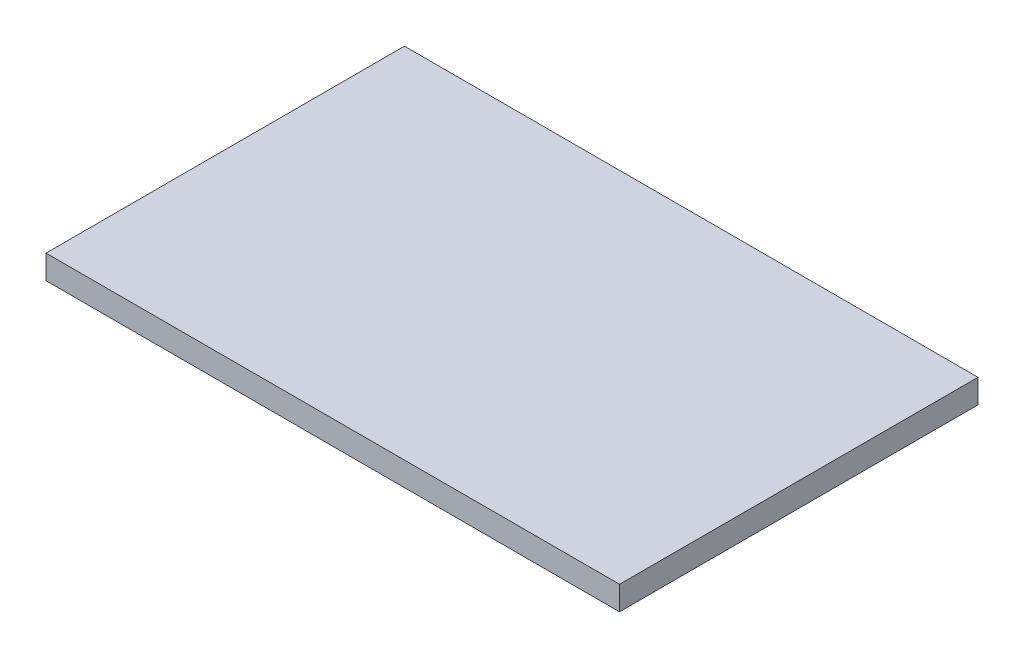
ISO-10303-21;
HEADER;
FILE_DESCRIPTION(('STEP AP214'),'2;1');
FILE_NAME('part.step','',(''),(''),'','','');
FILE_SCHEMA(('AUTOMOTIVE_DESIGN { 1 0 10303 214 1 1 1 1 }'));
ENDSEC;
DATA;
#1=APPLICATION_CONTEXT('core data for automotive mechanical design processes');
#2=APPLICATION_PROTOCOL_DEFINITION('international standard','automotive_design',2000,#1);
#3=PRODUCT_CONTEXT('',#1,'mechanical');
#4=PRODUCT('Part','Part','',(#3));
#5=PRODUCT_RELATED_PRODUCT_CATEGORY('part','',(#4));
#6=PRODUCT_DEFINITION_FORMATION('','',#4);
#7=PRODUCT_DEFINITION_CONTEXT('part definition',#1,'design');
#8=PRODUCT_DEFINITION('design','',#6,#7);
#9=PRODUCT_DEFINITION_SHAPE('','',#8);
#10=(LENGTH_UNIT() NAMED_UNIT(*) SI_UNIT(.MILLI.,.METRE.));
#11=(NAMED_UNIT(*) PLANE_ANGLE_UNIT() SI_UNIT($,.RADIAN.));
#12=(NAMED_UNIT(*) SI_UNIT($,.STERADIAN.) SOLID_ANGLE_UNIT());
#13=UNCERTAINTY_MEASURE_WITH_UNIT(LENGTH_MEASURE(1.E-05),#10,'distance_accuracy_value','');
#14=(GEOMETRIC_REPRESENTATION_CONTEXT(3) GLOBAL_UNCERTAINTY_ASSIGNED_CONTEXT((#13)) GLOBAL_UNIT_ASSIGNED_CONTEXT((#10,
#11,#12)) REPRESENTATION_CONTEXT('',''));
#15=CARTESIAN_POINT('',(0.,0.,0.));
#16=DIRECTION('',(0.,0.,1.));
#17=DIRECTION('',(1.,0.,0.));
#18=AXIS2_PLACEMENT_3D('',#15,#16,#17);
#19=CARTESIAN_POINT('',(0.,5.,0.));
#20=DIRECTION('',(1.,0.,0.));
#21=DIRECTION('',(0.,0.,-1.));
#22=AXIS2_PLACEMENT_3D('',#19,#20,#21);
#23=PLANE('',#22);
#24=DIRECTION('',(0.,0.,1.));
#25=VECTOR('',#24,1.);
#26=CARTESIAN_POINT('',(0.,0.,0.));
#27=LINE('',#26,#25);
#28=CARTESIAN_POINT('',(0.,0.,-75.));
#29=VERTEX_POINT('',#28);
#30=CARTESIAN_POINT('',(0.,0.,0.));
#31=VERTEX_POINT('',#30);
#32=EDGE_CURVE('E107',#29,#31,#27,.T.);
#33=ORIENTED_EDGE('',*,*,#32,.T.);
#34=DIRECTION('',(0.,-1.,0.));
#35=VECTOR('',#34,1.);
#36=CARTESIAN_POINT('',(0.,5.,0.));
#37=LINE('',#36,#35);
#38=CARTESIAN_POINT('',(0.,5.,0.));
#39=VERTEX_POINT('',#38);
#40=EDGE_CURVE('E11',#39,#31,#37,.T.);
#41=ORIENTED_EDGE('',*,*,#40,.F.);
#42=DIRECTION('',(0.,0.,1.));
#43=VECTOR('',#42,1.);
#44=CARTESIAN_POINT('',(0.,5.,0.));
#45=LINE('',#44,#43);
#46=CARTESIAN_POINT('',(0.,5.,-75.));
#47=VERTEX_POINT('',#46);
#48=EDGE_CURVE('E91',#47,#39,#45,.T.);
#49=ORIENTED_EDGE('',*,*,#48,.F.);
#50=DIRECTION('',(0.,-1.,0.));
#51=VECTOR('',#50,1.);
#52=CARTESIAN_POINT('',(0.,5.,-75.));
#53=LINE('',#52,#51);
#54=EDGE_CURVE('E103',#47,#29,#53,.T.);
#55=ORIENTED_EDGE('',*,*,#54,.T.);
#56=EDGE_LOOP('',(#33,#41,#49,#55));
#57=FACE_BOUND('',#56,.T.);
#58=ADVANCED_FACE('F39',(#57),#23,.F.);
#59=CARTESIAN_POINT('',(0.,5.,0.));
#60=DIRECTION('',(0.,0.,-1.));
#61=DIRECTION('',(-1.,0.,0.));
#62=AXIS2_PLACEMENT_3D('',#59,#60,#61);
#63=PLANE('',#62);
#64=DIRECTION('',(1.,0.,0.));
#65=VECTOR('',#64,1.);
#66=CARTESIAN_POINT('',(0.,0.,0.));
#67=LINE('',#66,#65);
#68=CARTESIAN_POINT('',(120.,0.,0.));
#69=VERTEX_POINT('',#68);
#70=EDGE_CURVE('E96',#31,#69,#67,.T.);
#71=ORIENTED_EDGE('',*,*,#70,.T.);
#72=DIRECTION('',(0.,-1.,0.));
#73=VECTOR('',#72,1.);
#74=CARTESIAN_POINT('',(120.,5.,0.));
#75=LINE('',#74,#73);
#76=CARTESIAN_POINT('',(120.,5.,0.));
#77=VERTEX_POINT('',#76);
#78=EDGE_CURVE('E48',#77,#69,#75,.T.);
#79=ORIENTED_EDGE('',*,*,#78,.F.);
#80=DIRECTION('',(1.,0.,0.));
#81=VECTOR('',#80,1.);
#82=CARTESIAN_POINT('',(0.,5.,0.));
#83=LINE('',#82,#81);
#84=EDGE_CURVE('E86',#39,#77,#83,.T.);
#85=ORIENTED_EDGE('',*,*,#84,.F.);
#86=ORIENTED_EDGE('',*,*,#40,.T.);
#87=EDGE_LOOP('',(#71,#79,#85,#86));
#88=FACE_BOUND('',#87,.T.);
#89=ADVANCED_FACE('F95',(#88),#63,.F.);
#90=CARTESIAN_POINT('',(120.,5.,0.));
#91=DIRECTION('',(-1.,0.,0.));
#92=DIRECTION('',(0.,0.,1.));
#93=AXIS2_PLACEMENT_3D('',#90,#91,#92);
#94=PLANE('',#93);
#95=DIRECTION('',(0.,0.,-1.));
#96=VECTOR('',#95,1.);
#97=CARTESIAN_POINT('',(120.,0.,0.));
#98=LINE('',#97,#96);
#99=CARTESIAN_POINT('',(120.,0.,-75.));
#100=VERTEX_POINT('',#99);
#101=EDGE_CURVE('E73',#69,#100,#98,.T.);
#102=ORIENTED_EDGE('',*,*,#101,.T.);
#103=DIRECTION('',(0.,-1.,0.));
#104=VECTOR('',#103,1.);
#105=CARTESIAN_POINT('',(120.,5.,-75.));
#106=LINE('',#105,#104);
#107=CARTESIAN_POINT('',(120.,5.,-75.));
#108=VERTEX_POINT('',#107);
#109=EDGE_CURVE('E98',#108,#100,#106,.T.);
#110=ORIENTED_EDGE('',*,*,#109,.F.);
#111=DIRECTION('',(0.,0.,-1.));
#112=VECTOR('',#111,1.);
#113=CARTESIAN_POINT('',(120.,5.,0.));
#114=LINE('',#113,#112);
#115=EDGE_CURVE('E89',#77,#108,#114,.T.);
#116=ORIENTED_EDGE('',*,*,#115,.F.);
#117=ORIENTED_EDGE('',*,*,#78,.T.);
#118=EDGE_LOOP('',(#102,#110,#116,#117));
#119=FACE_BOUND('',#118,.T.);
#120=ADVANCED_FACE('F99',(#119),#94,.F.);
#121=CARTESIAN_POINT('',(0.,5.,-75.));
#122=DIRECTION('',(0.,0.,1.));
#123=DIRECTION('',(1.,0.,0.));
#124=AXIS2_PLACEMENT_3D('',#121,#122,#123);
#125=PLANE('',#124);
#126=DIRECTION('',(-1.,0.,0.));
#127=VECTOR('',#126,1.);
#128=CARTESIAN_POINT('',(0.,0.,-75.));
#129=LINE('',#128,#127);
#130=EDGE_CURVE('E79',#100,#29,#129,.T.);
#131=ORIENTED_EDGE('',*,*,#130,.T.);
#132=ORIENTED_EDGE('',*,*,#54,.F.);
#133=DIRECTION('',(-1.,0.,0.));
#134=VECTOR('',#133,1.);
#135=CARTESIAN_POINT('',(0.,5.,-75.));
#136=LINE('',#135,#134);
#137=EDGE_CURVE('E56',#108,#47,#136,.T.);
#138=ORIENTED_EDGE('',*,*,#137,.F.);
#139=ORIENTED_EDGE('',*,*,#109,.T.);
#140=EDGE_LOOP('',(#131,#132,#138,#139));
#141=FACE_BOUND('',#140,.T.);
#142=ADVANCED_FACE('F120',(#141),#125,.F.);
#143=CARTESIAN_POINT('',(0.,5.,0.));
#144=DIRECTION('',(0.,-1.,0.));
#145=DIRECTION('',(0.,0.,-1.));
#146=AXIS2_PLACEMENT_3D('',#143,#144,#145);
#147=PLANE('',#146);
#148=ORIENTED_EDGE('',*,*,#48,.T.);
#149=ORIENTED_EDGE('',*,*,#84,.T.);
#150=ORIENTED_EDGE('',*,*,#115,.T.);
#151=ORIENTED_EDGE('',*,*,#137,.T.);
#152=EDGE_LOOP('',(#148,#149,#150,#151));
#153=FACE_BOUND('',#152,.T.);
#154=ADVANCED_FACE('F87',(#153),#147,.F.);
#155=CARTESIAN_POINT('',(0.,0.,0.));
#156=DIRECTION('',(0.,-1.,0.));
#157=DIRECTION('',(0.,0.,-1.));
#158=AXIS2_PLACEMENT_3D('',#155,#156,#157);
#159=PLANE('',#158);
#160=ORIENTED_EDGE('',*,*,#32,.F.);
#161=ORIENTED_EDGE('',*,*,#130,.F.);
#162=ORIENTED_EDGE('',*,*,#101,.F.);
#163=ORIENTED_EDGE('',*,*,#70,.F.);
#164=EDGE_LOOP('',(#160,#161,#162,#163));
#165=FACE_BOUND('',#164,.T.);
#166=ADVANCED_FACE('F123',(#165),#159,.T.);
#167=CLOSED_SHELL('',(#58,#89,#120,#142,#154,#166));
#168=MANIFOLD_SOLID_BREP('B2',#167);
#169=ADVANCED_BREP_SHAPE_REPRESENTATION('',(#18,#168),#14);
#170=SHAPE_DEFINITION_REPRESENTATION(#9,#169);
ENDSEC;
END-ISO-10303-21;
